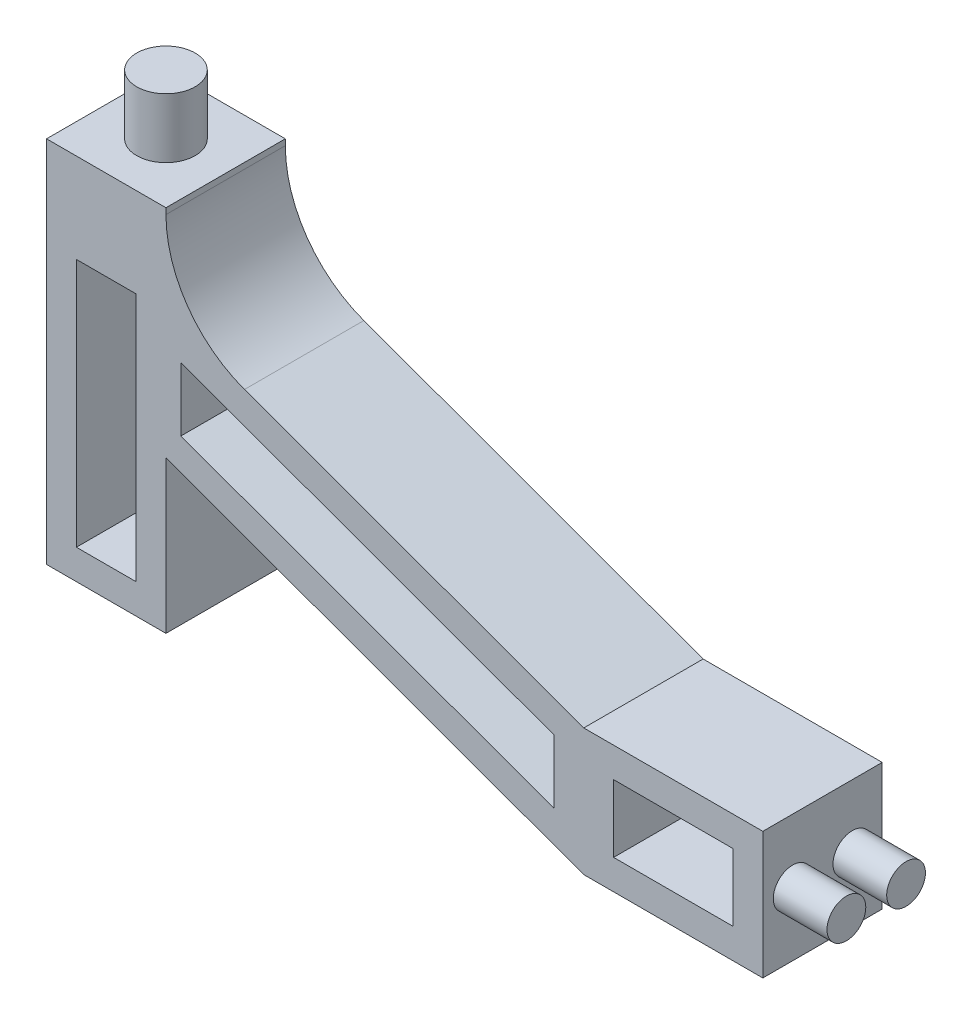
ISO-10303-21;
HEADER;
FILE_DESCRIPTION(('STEP AP214'),'2;1');
FILE_NAME('part.step','',(''),(''),'','','');
FILE_SCHEMA(('AUTOMOTIVE_DESIGN { 1 0 10303 214 1 1 1 1 }'));
ENDSEC;
DATA;
#1=APPLICATION_CONTEXT('core data for automotive mechanical design processes');
#2=APPLICATION_PROTOCOL_DEFINITION('international standard','automotive_design',2000,#1);
#3=PRODUCT_CONTEXT('',#1,'mechanical');
#4=PRODUCT('Part','Part','',(#3));
#5=PRODUCT_RELATED_PRODUCT_CATEGORY('part','',(#4));
#6=PRODUCT_DEFINITION_FORMATION('','',#4);
#7=PRODUCT_DEFINITION_CONTEXT('part definition',#1,'design');
#8=PRODUCT_DEFINITION('design','',#6,#7);
#9=PRODUCT_DEFINITION_SHAPE('','',#8);
#10=(LENGTH_UNIT() NAMED_UNIT(*) SI_UNIT(.MILLI.,.METRE.));
#11=(NAMED_UNIT(*) PLANE_ANGLE_UNIT() SI_UNIT($,.RADIAN.));
#12=(NAMED_UNIT(*) SI_UNIT($,.STERADIAN.) SOLID_ANGLE_UNIT());
#13=UNCERTAINTY_MEASURE_WITH_UNIT(LENGTH_MEASURE(1.E-05),#10,'distance_accuracy_value','');
#14=(GEOMETRIC_REPRESENTATION_CONTEXT(3) GLOBAL_UNCERTAINTY_ASSIGNED_CONTEXT((#13)) GLOBAL_UNIT_ASSIGNED_CONTEXT((#10,
#11,#12)) REPRESENTATION_CONTEXT('',''));
#15=CARTESIAN_POINT('',(0.,0.,0.));
#16=DIRECTION('',(0.,0.,1.));
#17=DIRECTION('',(1.,0.,0.));
#18=AXIS2_PLACEMENT_3D('',#15,#16,#17);
#19=CARTESIAN_POINT('',(0.,0.,20.));
#20=DIRECTION('',(0.,0.,1.));
#21=DIRECTION('',(1.,0.,0.));
#22=AXIS2_PLACEMENT_3D('',#19,#20,#21);
#23=PLANE('',#22);
#24=DIRECTION('',(0.,-1.,0.));
#25=VECTOR('',#24,1.);
#26=CARTESIAN_POINT('',(-125.,5.,20.));
#27=LINE('',#26,#25);
#28=CARTESIAN_POINT('',(-125.,46.7614718481525,20.));
#29=VERTEX_POINT('',#28);
#30=CARTESIAN_POINT('',(-125.,5.,20.));
#31=VERTEX_POINT('',#30);
#32=EDGE_CURVE('E344',#29,#31,#27,.T.);
#33=ORIENTED_EDGE('',*,*,#32,.F.);
#34=DIRECTION('',(-1.,0.,0.));
#35=VECTOR('',#34,1.);
#36=CARTESIAN_POINT('',(-125.,46.7614718481525,20.));
#37=LINE('',#36,#35);
#38=CARTESIAN_POINT('',(-115.,46.7614718481525,20.));
#39=VERTEX_POINT('',#38);
#40=EDGE_CURVE('E342',#39,#29,#37,.T.);
#41=ORIENTED_EDGE('',*,*,#40,.F.);
#42=DIRECTION('',(0.,1.,0.));
#43=VECTOR('',#42,1.);
#44=CARTESIAN_POINT('',(-115.,46.7614718481525,20.));
#45=LINE('',#44,#43);
#46=CARTESIAN_POINT('',(-115.,5.,20.));
#47=VERTEX_POINT('',#46);
#48=EDGE_CURVE('E350',#47,#39,#45,.T.);
#49=ORIENTED_EDGE('',*,*,#48,.F.);
#50=DIRECTION('',(1.,0.,0.));
#51=VECTOR('',#50,1.);
#52=CARTESIAN_POINT('',(-115.,5.,20.));
#53=LINE('',#52,#51);
#54=EDGE_CURVE('E347',#31,#47,#53,.T.);
#55=ORIENTED_EDGE('',*,*,#54,.F.);
#56=EDGE_LOOP('',(#33,#41,#49,#55));
#57=FACE_BOUND('',#56,.T.);
#58=DIRECTION('',(0.939692620785908,-0.342020143325669,0.));
#59=VECTOR('',#58,1.);
#60=CARTESIAN_POINT('',(-45.,7.14074003371057,20.));
#61=LINE('',#60,#59);
#62=CARTESIAN_POINT('',(-107.5,29.8888796753482,20.));
#63=VERTEX_POINT('',#62);
#64=CARTESIAN_POINT('',(-45.,7.14074003371057,20.));
#65=VERTEX_POINT('',#64);
#66=EDGE_CURVE('E313',#63,#65,#61,.T.);
#67=ORIENTED_EDGE('',*,*,#66,.F.);
#68=DIRECTION('',(0.,-1.,0.));
#69=VECTOR('',#68,1.);
#70=CARTESIAN_POINT('',(-107.5,29.8888796753482,20.));
#71=LINE('',#70,#69);
#72=CARTESIAN_POINT('',(-107.5,40.5306574001074,20.));
#73=VERTEX_POINT('',#72);
#74=EDGE_CURVE('E311',#73,#63,#71,.T.);
#75=ORIENTED_EDGE('',*,*,#74,.F.);
#76=DIRECTION('',(-0.939692620785908,0.342020143325669,0.));
#77=VECTOR('',#76,1.);
#78=CARTESIAN_POINT('',(-107.5,40.5306574001074,20.));
#79=LINE('',#78,#77);
#80=CARTESIAN_POINT('',(-45.,17.7825177584697,20.));
#81=VERTEX_POINT('',#80);
#82=EDGE_CURVE('E319',#81,#73,#79,.T.);
#83=ORIENTED_EDGE('',*,*,#82,.F.);
#84=DIRECTION('',(0.,1.,0.));
#85=VECTOR('',#84,1.);
#86=CARTESIAN_POINT('',(-45.,7.14074003371057,20.));
#87=LINE('',#86,#85);
#88=EDGE_CURVE('E316',#65,#81,#87,.T.);
#89=ORIENTED_EDGE('',*,*,#88,.F.);
#90=EDGE_LOOP('',(#67,#75,#83,#89));
#91=FACE_BOUND('',#90,.T.);
#92=DIRECTION('',(1.,0.,0.));
#93=VECTOR('',#92,1.);
#94=CARTESIAN_POINT('',(-35.,5.,20.));
#95=LINE('',#94,#93);
#96=CARTESIAN_POINT('',(-35.,5.,20.));
#97=VERTEX_POINT('',#96);
#98=CARTESIAN_POINT('',(-15.,5.,20.));
#99=VERTEX_POINT('',#98);
#100=EDGE_CURVE('E281',#97,#99,#95,.T.);
#101=ORIENTED_EDGE('',*,*,#100,.F.);
#102=DIRECTION('',(0.,-1.,0.));
#103=VECTOR('',#102,1.);
#104=CARTESIAN_POINT('',(-35.,16.2835554495182,20.));
#105=LINE('',#104,#103);
#106=CARTESIAN_POINT('',(-35.,16.2835554495182,20.));
#107=VERTEX_POINT('',#106);
#108=EDGE_CURVE('E279',#107,#97,#105,.T.);
#109=ORIENTED_EDGE('',*,*,#108,.F.);
#110=DIRECTION('',(-1.,0.,0.));
#111=VECTOR('',#110,1.);
#112=CARTESIAN_POINT('',(-35.,16.2835554495182,20.));
#113=LINE('',#112,#111);
#114=CARTESIAN_POINT('',(-15.,16.2835554495182,20.));
#115=VERTEX_POINT('',#114);
#116=EDGE_CURVE('E287',#115,#107,#113,.T.);
#117=ORIENTED_EDGE('',*,*,#116,.F.);
#118=DIRECTION('',(0.,1.,0.));
#119=VECTOR('',#118,1.);
#120=CARTESIAN_POINT('',(-15.,16.2835554495182,20.));
#121=LINE('',#120,#119);
#122=EDGE_CURVE('E284',#99,#115,#121,.T.);
#123=ORIENTED_EDGE('',*,*,#122,.F.);
#124=EDGE_LOOP('',(#101,#109,#117,#123));
#125=FACE_BOUND('',#124,.T.);
#126=DIRECTION('',(1.,0.,0.));
#127=VECTOR('',#126,1.);
#128=CARTESIAN_POINT('',(0.,0.,20.));
#129=LINE('',#128,#127);
#130=CARTESIAN_POINT('',(-40.,0.,20.));
#131=VERTEX_POINT('',#130);
#132=CARTESIAN_POINT('',(-10.,0.,20.));
#133=VERTEX_POINT('',#132);
#134=EDGE_CURVE('E200',#131,#133,#129,.T.);
#135=ORIENTED_EDGE('',*,*,#134,.T.);
#136=DIRECTION('',(0.,1.,0.));
#137=VECTOR('',#136,1.);
#138=CARTESIAN_POINT('',(-10.,0.,20.));
#139=LINE('',#138,#137);
#140=CARTESIAN_POINT('',(-10.,21.2835554495182,20.));
#141=VERTEX_POINT('',#140);
#142=EDGE_CURVE('E190',#133,#141,#139,.T.);
#143=ORIENTED_EDGE('',*,*,#142,.T.);
#144=DIRECTION('',(-1.,0.,0.));
#145=VECTOR('',#144,1.);
#146=CARTESIAN_POINT('',(-40.,21.2835554495182,20.));
#147=LINE('',#146,#145);
#148=CARTESIAN_POINT('',(-40.,21.2835554495182,20.));
#149=VERTEX_POINT('',#148);
#150=EDGE_CURVE('E197',#141,#149,#147,.T.);
#151=ORIENTED_EDGE('',*,*,#150,.T.);
#152=DIRECTION('',(-0.939692620785908,0.34202014332567,0.));
#153=VECTOR('',#152,1.);
#154=CARTESIAN_POINT('',(-110.,46.7614718481525,20.));
#155=LINE('',#154,#153);
#156=CARTESIAN_POINT('',(-96.8404028665134,41.9717701966285,20.));
#157=VERTEX_POINT('',#156);
#158=EDGE_CURVE('E206',#149,#157,#155,.T.);
#159=ORIENTED_EDGE('',*,*,#158,.T.);
#160=CARTESIAN_POINT('',(-90.,60.7656226123466,20.));
#161=DIRECTION('',(0.,0.,1.));
#162=DIRECTION('',(1.,0.,0.));
#163=AXIS2_PLACEMENT_3D('',#160,#161,#162);
#164=CIRCLE('',#163,20.);
#165=CARTESIAN_POINT('',(-110.,60.7656226123466,20.));
#166=VERTEX_POINT('',#165);
#167=EDGE_CURVE('E268',#157,#166,#164,.F.);
#168=ORIENTED_EDGE('',*,*,#167,.T.);
#169=DIRECTION('',(0.,1.,0.));
#170=VECTOR('',#169,1.);
#171=CARTESIAN_POINT('',(-110.,46.7614718481525,20.));
#172=LINE('',#171,#170);
#173=CARTESIAN_POINT('',(-110.,61.7614718481525,20.));
#174=VERTEX_POINT('',#173);
#175=EDGE_CURVE('E208',#166,#174,#172,.T.);
#176=ORIENTED_EDGE('',*,*,#175,.T.);
#177=DIRECTION('',(-1.,0.,0.));
#178=VECTOR('',#177,1.);
#179=CARTESIAN_POINT('',(-110.,61.7614718481525,20.));
#180=LINE('',#179,#178);
#181=CARTESIAN_POINT('',(-130.,61.7614718481524,20.));
#182=VERTEX_POINT('',#181);
#183=EDGE_CURVE('E215',#174,#182,#180,.T.);
#184=ORIENTED_EDGE('',*,*,#183,.T.);
#185=DIRECTION('',(0.,-1.,0.));
#186=VECTOR('',#185,1.);
#187=CARTESIAN_POINT('',(-130.,0.,20.));
#188=LINE('',#187,#186);
#189=CARTESIAN_POINT('',(-130.,0.,20.));
#190=VERTEX_POINT('',#189);
#191=EDGE_CURVE('E217',#182,#190,#188,.T.);
#192=ORIENTED_EDGE('',*,*,#191,.T.);
#193=DIRECTION('',(1.,0.,0.));
#194=VECTOR('',#193,1.);
#195=CARTESIAN_POINT('',(-110.,0.,20.));
#196=LINE('',#195,#194);
#197=CARTESIAN_POINT('',(-110.,0.,20.));
#198=VERTEX_POINT('',#197);
#199=EDGE_CURVE('E219',#190,#198,#196,.T.);
#200=ORIENTED_EDGE('',*,*,#199,.T.);
#201=DIRECTION('',(0.,1.,0.));
#202=VECTOR('',#201,1.);
#203=CARTESIAN_POINT('',(-110.,25.4779163986342,20.));
#204=LINE('',#203,#202);
#205=CARTESIAN_POINT('',(-110.,25.4779163986342,20.));
#206=VERTEX_POINT('',#205);
#207=EDGE_CURVE('E221',#198,#206,#204,.T.);
#208=ORIENTED_EDGE('',*,*,#207,.T.);
#209=DIRECTION('',(0.939692620785908,-0.342020143325669,0.));
#210=VECTOR('',#209,1.);
#211=CARTESIAN_POINT('',(-40.,0.,20.));
#212=LINE('',#211,#210);
#213=EDGE_CURVE('E223',#206,#131,#212,.T.);
#214=ORIENTED_EDGE('',*,*,#213,.T.);
#215=EDGE_LOOP('',(#135,#143,#151,#159,#168,#176,#184,#192,#200,#208,#214));
#216=FACE_BOUND('',#215,.T.);
#217=ADVANCED_FACE('F35',(#57,#91,#125,#216),#23,.T.);
#218=CARTESIAN_POINT('',(0.,0.,0.));
#219=DIRECTION('',(0.,0.,1.));
#220=DIRECTION('',(1.,0.,0.));
#221=AXIS2_PLACEMENT_3D('',#218,#219,#220);
#222=PLANE('',#221);
#223=DIRECTION('',(0.,-1.,0.));
#224=VECTOR('',#223,1.);
#225=CARTESIAN_POINT('',(-35.,16.2835554495182,0.));
#226=LINE('',#225,#224);
#227=CARTESIAN_POINT('',(-35.,16.2835554495182,0.));
#228=VERTEX_POINT('',#227);
#229=CARTESIAN_POINT('',(-35.,5.,0.));
#230=VERTEX_POINT('',#229);
#231=EDGE_CURVE('E290',#228,#230,#226,.T.);
#232=ORIENTED_EDGE('',*,*,#231,.T.);
#233=DIRECTION('',(1.,0.,0.));
#234=VECTOR('',#233,1.);
#235=CARTESIAN_POINT('',(-35.,5.,0.));
#236=LINE('',#235,#234);
#237=CARTESIAN_POINT('',(-15.,5.,0.));
#238=VERTEX_POINT('',#237);
#239=EDGE_CURVE('E293',#230,#238,#236,.T.);
#240=ORIENTED_EDGE('',*,*,#239,.T.);
#241=DIRECTION('',(0.,1.,0.));
#242=VECTOR('',#241,1.);
#243=CARTESIAN_POINT('',(-15.,16.2835554495182,0.));
#244=LINE('',#243,#242);
#245=CARTESIAN_POINT('',(-15.,16.2835554495182,0.));
#246=VERTEX_POINT('',#245);
#247=EDGE_CURVE('E296',#238,#246,#244,.T.);
#248=ORIENTED_EDGE('',*,*,#247,.T.);
#249=DIRECTION('',(-1.,0.,0.));
#250=VECTOR('',#249,1.);
#251=CARTESIAN_POINT('',(-35.,16.2835554495182,0.));
#252=LINE('',#251,#250);
#253=EDGE_CURVE('E282',#246,#228,#252,.T.);
#254=ORIENTED_EDGE('',*,*,#253,.T.);
#255=EDGE_LOOP('',(#232,#240,#248,#254));
#256=FACE_BOUND('',#255,.T.);
#257=DIRECTION('',(-1.,0.,0.));
#258=VECTOR('',#257,1.);
#259=CARTESIAN_POINT('',(-125.,46.7614718481525,0.));
#260=LINE('',#259,#258);
#261=CARTESIAN_POINT('',(-115.,46.7614718481525,0.));
#262=VERTEX_POINT('',#261);
#263=CARTESIAN_POINT('',(-125.,46.7614718481525,0.));
#264=VERTEX_POINT('',#263);
#265=EDGE_CURVE('E341',#262,#264,#260,.T.);
#266=ORIENTED_EDGE('',*,*,#265,.T.);
#267=DIRECTION('',(0.,-1.,0.));
#268=VECTOR('',#267,1.);
#269=CARTESIAN_POINT('',(-125.,5.,0.));
#270=LINE('',#269,#268);
#271=CARTESIAN_POINT('',(-125.,5.,0.));
#272=VERTEX_POINT('',#271);
#273=EDGE_CURVE('E355',#264,#272,#270,.T.);
#274=ORIENTED_EDGE('',*,*,#273,.T.);
#275=DIRECTION('',(1.,0.,0.));
#276=VECTOR('',#275,1.);
#277=CARTESIAN_POINT('',(-115.,5.,0.));
#278=LINE('',#277,#276);
#279=CARTESIAN_POINT('',(-115.,5.,0.));
#280=VERTEX_POINT('',#279);
#281=EDGE_CURVE('E358',#272,#280,#278,.T.);
#282=ORIENTED_EDGE('',*,*,#281,.T.);
#283=DIRECTION('',(0.,1.,0.));
#284=VECTOR('',#283,1.);
#285=CARTESIAN_POINT('',(-115.,46.7614718481525,0.));
#286=LINE('',#285,#284);
#287=EDGE_CURVE('E345',#280,#262,#286,.T.);
#288=ORIENTED_EDGE('',*,*,#287,.T.);
#289=EDGE_LOOP('',(#266,#274,#282,#288));
#290=FACE_BOUND('',#289,.T.);
#291=DIRECTION('',(0.,-1.,0.));
#292=VECTOR('',#291,1.);
#293=CARTESIAN_POINT('',(-107.5,29.8888796753482,0.));
#294=LINE('',#293,#292);
#295=CARTESIAN_POINT('',(-107.5,40.5306574001074,0.));
#296=VERTEX_POINT('',#295);
#297=CARTESIAN_POINT('',(-107.5,29.8888796753482,0.));
#298=VERTEX_POINT('',#297);
#299=EDGE_CURVE('E310',#296,#298,#294,.T.);
#300=ORIENTED_EDGE('',*,*,#299,.T.);
#301=DIRECTION('',(0.939692620785908,-0.342020143325669,0.));
#302=VECTOR('',#301,1.);
#303=CARTESIAN_POINT('',(-45.,7.14074003371057,0.));
#304=LINE('',#303,#302);
#305=CARTESIAN_POINT('',(-45.,7.14074003371057,0.));
#306=VERTEX_POINT('',#305);
#307=EDGE_CURVE('E324',#298,#306,#304,.T.);
#308=ORIENTED_EDGE('',*,*,#307,.T.);
#309=DIRECTION('',(0.,1.,0.));
#310=VECTOR('',#309,1.);
#311=CARTESIAN_POINT('',(-45.,7.14074003371057,0.));
#312=LINE('',#311,#310);
#313=CARTESIAN_POINT('',(-45.,17.7825177584697,0.));
#314=VERTEX_POINT('',#313);
#315=EDGE_CURVE('E327',#306,#314,#312,.T.);
#316=ORIENTED_EDGE('',*,*,#315,.T.);
#317=DIRECTION('',(-0.939692620785908,0.342020143325669,0.));
#318=VECTOR('',#317,1.);
#319=CARTESIAN_POINT('',(-107.5,40.5306574001074,0.));
#320=LINE('',#319,#318);
#321=EDGE_CURVE('E314',#314,#296,#320,.T.);
#322=ORIENTED_EDGE('',*,*,#321,.T.);
#323=EDGE_LOOP('',(#300,#308,#316,#322));
#324=FACE_BOUND('',#323,.T.);
#325=DIRECTION('',(0.,1.,0.));
#326=VECTOR('',#325,1.);
#327=CARTESIAN_POINT('',(-10.,0.,0.));
#328=LINE('',#327,#326);
#329=CARTESIAN_POINT('',(-10.,0.,0.));
#330=VERTEX_POINT('',#329);
#331=CARTESIAN_POINT('',(-10.,21.2835554495182,0.));
#332=VERTEX_POINT('',#331);
#333=EDGE_CURVE('E49',#330,#332,#328,.T.);
#334=ORIENTED_EDGE('',*,*,#333,.F.);
#335=DIRECTION('',(1.,0.,0.));
#336=VECTOR('',#335,1.);
#337=CARTESIAN_POINT('',(0.,0.,0.));
#338=LINE('',#337,#336);
#339=CARTESIAN_POINT('',(-40.,0.,0.));
#340=VERTEX_POINT('',#339);
#341=EDGE_CURVE('E226',#340,#330,#338,.T.);
#342=ORIENTED_EDGE('',*,*,#341,.F.);
#343=DIRECTION('',(0.939692620785908,-0.342020143325669,0.));
#344=VECTOR('',#343,1.);
#345=CARTESIAN_POINT('',(-40.,0.,0.));
#346=LINE('',#345,#344);
#347=CARTESIAN_POINT('',(-110.,25.4779163986342,0.));
#348=VERTEX_POINT('',#347);
#349=EDGE_CURVE('E210',#348,#340,#346,.T.);
#350=ORIENTED_EDGE('',*,*,#349,.F.);
#351=DIRECTION('',(0.,1.,0.));
#352=VECTOR('',#351,1.);
#353=CARTESIAN_POINT('',(-110.,25.4779163986342,0.));
#354=LINE('',#353,#352);
#355=CARTESIAN_POINT('',(-110.,0.,0.));
#356=VERTEX_POINT('',#355);
#357=EDGE_CURVE('E242',#356,#348,#354,.T.);
#358=ORIENTED_EDGE('',*,*,#357,.F.);
#359=DIRECTION('',(1.,0.,0.));
#360=VECTOR('',#359,1.);
#361=CARTESIAN_POINT('',(-110.,0.,0.));
#362=LINE('',#361,#360);
#363=CARTESIAN_POINT('',(-130.,0.,0.));
#364=VERTEX_POINT('',#363);
#365=EDGE_CURVE('E240',#364,#356,#362,.T.);
#366=ORIENTED_EDGE('',*,*,#365,.F.);
#367=DIRECTION('',(0.,-1.,0.));
#368=VECTOR('',#367,1.);
#369=CARTESIAN_POINT('',(-130.,0.,0.));
#370=LINE('',#369,#368);
#371=CARTESIAN_POINT('',(-130.,61.7614718481524,0.));
#372=VERTEX_POINT('',#371);
#373=EDGE_CURVE('E238',#372,#364,#370,.T.);
#374=ORIENTED_EDGE('',*,*,#373,.F.);
#375=DIRECTION('',(-1.,0.,0.));
#376=VECTOR('',#375,1.);
#377=CARTESIAN_POINT('',(-110.,61.7614718481525,0.));
#378=LINE('',#377,#376);
#379=CARTESIAN_POINT('',(-110.,61.7614718481525,0.));
#380=VERTEX_POINT('',#379);
#381=EDGE_CURVE('E236',#380,#372,#378,.T.);
#382=ORIENTED_EDGE('',*,*,#381,.F.);
#383=DIRECTION('',(0.,1.,0.));
#384=VECTOR('',#383,1.);
#385=CARTESIAN_POINT('',(-110.,46.7614718481525,0.));
#386=LINE('',#385,#384);
#387=CARTESIAN_POINT('',(-110.,60.7656226123466,0.));
#388=VERTEX_POINT('',#387);
#389=EDGE_CURVE('E234',#388,#380,#386,.T.);
#390=ORIENTED_EDGE('',*,*,#389,.F.);
#391=CARTESIAN_POINT('',(-90.,60.7656226123466,0.));
#392=DIRECTION('',(0.,0.,1.));
#393=DIRECTION('',(1.,0.,0.));
#394=AXIS2_PLACEMENT_3D('',#391,#392,#393);
#395=CIRCLE('',#394,20.);
#396=CARTESIAN_POINT('',(-96.8404028665134,41.9717701966285,0.));
#397=VERTEX_POINT('',#396);
#398=EDGE_CURVE('E267',#388,#397,#395,.T.);
#399=ORIENTED_EDGE('',*,*,#398,.T.);
#400=DIRECTION('',(-0.939692620785908,0.34202014332567,0.));
#401=VECTOR('',#400,1.);
#402=CARTESIAN_POINT('',(-110.,46.7614718481525,0.));
#403=LINE('',#402,#401);
#404=CARTESIAN_POINT('',(-40.,21.2835554495182,0.));
#405=VERTEX_POINT('',#404);
#406=EDGE_CURVE('E232',#405,#397,#403,.T.);
#407=ORIENTED_EDGE('',*,*,#406,.F.);
#408=DIRECTION('',(-1.,0.,0.));
#409=VECTOR('',#408,1.);
#410=CARTESIAN_POINT('',(-40.,21.2835554495182,0.));
#411=LINE('',#410,#409);
#412=EDGE_CURVE('E229',#332,#405,#411,.T.);
#413=ORIENTED_EDGE('',*,*,#412,.F.);
#414=EDGE_LOOP('',(#334,#342,#350,#358,#366,#374,#382,#390,#399,#407,#413));
#415=FACE_BOUND('',#414,.T.);
#416=ADVANCED_FACE('F377',(#256,#290,#324,#415),#222,.F.);
#417=CARTESIAN_POINT('',(0.,0.,20.));
#418=DIRECTION('',(0.,1.,0.));
#419=DIRECTION('',(-1.,0.,0.));
#420=AXIS2_PLACEMENT_3D('',#417,#418,#419);
#421=PLANE('',#420);
#422=DIRECTION('',(0.,0.,-1.));
#423=VECTOR('',#422,1.);
#424=CARTESIAN_POINT('',(-10.,0.,20.));
#425=LINE('',#424,#423);
#426=EDGE_CURVE('E201',#133,#330,#425,.T.);
#427=ORIENTED_EDGE('',*,*,#426,.F.);
#428=ORIENTED_EDGE('',*,*,#134,.F.);
#429=DIRECTION('',(0.,0.,-1.));
#430=VECTOR('',#429,1.);
#431=CARTESIAN_POINT('',(-40.,0.,20.));
#432=LINE('',#431,#430);
#433=EDGE_CURVE('E225',#131,#340,#432,.T.);
#434=ORIENTED_EDGE('',*,*,#433,.T.);
#435=ORIENTED_EDGE('',*,*,#341,.T.);
#436=EDGE_LOOP('',(#427,#428,#434,#435));
#437=FACE_BOUND('',#436,.T.);
#438=ADVANCED_FACE('F405',(#437),#421,.F.);
#439=CARTESIAN_POINT('',(-40.,21.2835554495182,20.));
#440=DIRECTION('',(0.,-1.,0.));
#441=DIRECTION('',(1.,0.,0.));
#442=AXIS2_PLACEMENT_3D('',#439,#440,#441);
#443=PLANE('',#442);
#444=DIRECTION('',(0.,0.,1.));
#445=VECTOR('',#444,1.);
#446=CARTESIAN_POINT('',(-10.,21.2835554495182,20.));
#447=LINE('',#446,#445);
#448=EDGE_CURVE('E11',#332,#141,#447,.T.);
#449=ORIENTED_EDGE('',*,*,#448,.F.);
#450=ORIENTED_EDGE('',*,*,#412,.T.);
#451=DIRECTION('',(0.,0.,-1.));
#452=VECTOR('',#451,1.);
#453=CARTESIAN_POINT('',(-40.,21.2835554495182,20.));
#454=LINE('',#453,#452);
#455=EDGE_CURVE('E205',#149,#405,#454,.T.);
#456=ORIENTED_EDGE('',*,*,#455,.F.);
#457=ORIENTED_EDGE('',*,*,#150,.F.);
#458=EDGE_LOOP('',(#449,#450,#456,#457));
#459=FACE_BOUND('',#458,.T.);
#460=ADVANCED_FACE('F203',(#459),#443,.F.);
#461=CARTESIAN_POINT('',(-110.,46.7614718481525,20.));
#462=DIRECTION('',(-0.34202014332567,-0.939692620785908,0.));
#463=DIRECTION('',(0.939692620785908,-0.34202014332567,0.));
#464=AXIS2_PLACEMENT_3D('',#461,#462,#463);
#465=PLANE('',#464);
#466=ORIENTED_EDGE('',*,*,#406,.T.);
#467=DIRECTION('',(0.,0.,-1.));
#468=VECTOR('',#467,1.);
#469=CARTESIAN_POINT('',(-96.8404028665134,41.9717701966285,20.));
#470=LINE('',#469,#468);
#471=EDGE_CURVE('E57',#397,#157,#470,.F.);
#472=ORIENTED_EDGE('',*,*,#471,.T.);
#473=ORIENTED_EDGE('',*,*,#158,.F.);
#474=ORIENTED_EDGE('',*,*,#455,.T.);
#475=EDGE_LOOP('',(#466,#472,#473,#474));
#476=FACE_BOUND('',#475,.T.);
#477=ADVANCED_FACE('F433',(#476),#465,.F.);
#478=CARTESIAN_POINT('',(-110.,46.7614718481525,20.));
#479=DIRECTION('',(-1.,0.,0.));
#480=DIRECTION('',(0.,-1.,0.));
#481=AXIS2_PLACEMENT_3D('',#478,#479,#480);
#482=PLANE('',#481);
#483=ORIENTED_EDGE('',*,*,#175,.F.);
#484=DIRECTION('',(0.,0.,-1.));
#485=VECTOR('',#484,1.);
#486=CARTESIAN_POINT('',(-110.,60.7656226123466,0.));
#487=LINE('',#486,#485);
#488=EDGE_CURVE('E263',#166,#388,#487,.T.);
#489=ORIENTED_EDGE('',*,*,#488,.T.);
#490=ORIENTED_EDGE('',*,*,#389,.T.);
#491=DIRECTION('',(0.,0.,-1.));
#492=VECTOR('',#491,1.);
#493=CARTESIAN_POINT('',(-110.,61.7614718481525,20.));
#494=LINE('',#493,#492);
#495=EDGE_CURVE('E259',#174,#380,#494,.T.);
#496=ORIENTED_EDGE('',*,*,#495,.F.);
#497=EDGE_LOOP('',(#483,#489,#490,#496));
#498=FACE_BOUND('',#497,.T.);
#499=ADVANCED_FACE('F429',(#498),#482,.F.);
#500=CARTESIAN_POINT('',(-110.,61.7614718481525,20.));
#501=DIRECTION('',(0.,-1.,0.));
#502=DIRECTION('',(1.,0.,0.));
#503=AXIS2_PLACEMENT_3D('',#500,#501,#502);
#504=PLANE('',#503);
#505=CARTESIAN_POINT('',(-120.,61.7614718481525,10.));
#506=DIRECTION('',(0.,1.,0.));
#507=DIRECTION('',(0.,0.,1.));
#508=AXIS2_PLACEMENT_3D('',#505,#506,#507);
#509=CIRCLE('',#508,4.9);
#510=CARTESIAN_POINT('',(-120.,61.7614718481525,14.9));
#511=VERTEX_POINT('',#510);
#512=EDGE_CURVE('E43',#511,#511,#509,.T.);
#513=ORIENTED_EDGE('',*,*,#512,.F.);
#514=EDGE_LOOP('',(#513));
#515=FACE_BOUND('',#514,.T.);
#516=ORIENTED_EDGE('',*,*,#381,.T.);
#517=DIRECTION('',(0.,0.,-1.));
#518=VECTOR('',#517,1.);
#519=CARTESIAN_POINT('',(-130.,61.7614718481524,20.));
#520=LINE('',#519,#518);
#521=EDGE_CURVE('E256',#182,#372,#520,.T.);
#522=ORIENTED_EDGE('',*,*,#521,.F.);
#523=ORIENTED_EDGE('',*,*,#183,.F.);
#524=ORIENTED_EDGE('',*,*,#495,.T.);
#525=EDGE_LOOP('',(#516,#522,#523,#524));
#526=FACE_BOUND('',#525,.T.);
#527=ADVANCED_FACE('F425',(#515,#526),#504,.F.);
#528=CARTESIAN_POINT('',(-130.,0.,20.));
#529=DIRECTION('',(1.,0.,0.));
#530=DIRECTION('',(0.,0.,-1.));
#531=AXIS2_PLACEMENT_3D('',#528,#529,#530);
#532=PLANE('',#531);
#533=ORIENTED_EDGE('',*,*,#373,.T.);
#534=DIRECTION('',(0.,0.,-1.));
#535=VECTOR('',#534,1.);
#536=CARTESIAN_POINT('',(-130.,0.,20.));
#537=LINE('',#536,#535);
#538=EDGE_CURVE('E253',#190,#364,#537,.T.);
#539=ORIENTED_EDGE('',*,*,#538,.F.);
#540=ORIENTED_EDGE('',*,*,#191,.F.);
#541=ORIENTED_EDGE('',*,*,#521,.T.);
#542=EDGE_LOOP('',(#533,#539,#540,#541));
#543=FACE_BOUND('',#542,.T.);
#544=ADVANCED_FACE('F421',(#543),#532,.F.);
#545=CARTESIAN_POINT('',(-110.,0.,20.));
#546=DIRECTION('',(0.,1.,0.));
#547=DIRECTION('',(-1.,0.,0.));
#548=AXIS2_PLACEMENT_3D('',#545,#546,#547);
#549=PLANE('',#548);
#550=ORIENTED_EDGE('',*,*,#365,.T.);
#551=DIRECTION('',(0.,0.,-1.));
#552=VECTOR('',#551,1.);
#553=CARTESIAN_POINT('',(-110.,0.,20.));
#554=LINE('',#553,#552);
#555=EDGE_CURVE('E250',#198,#356,#554,.T.);
#556=ORIENTED_EDGE('',*,*,#555,.F.);
#557=ORIENTED_EDGE('',*,*,#199,.F.);
#558=ORIENTED_EDGE('',*,*,#538,.T.);
#559=EDGE_LOOP('',(#550,#556,#557,#558));
#560=FACE_BOUND('',#559,.T.);
#561=ADVANCED_FACE('F417',(#560),#549,.F.);
#562=CARTESIAN_POINT('',(-110.,25.4779163986342,20.));
#563=DIRECTION('',(-1.,0.,0.));
#564=DIRECTION('',(0.,-1.,0.));
#565=AXIS2_PLACEMENT_3D('',#562,#563,#564);
#566=PLANE('',#565);
#567=ORIENTED_EDGE('',*,*,#357,.T.);
#568=DIRECTION('',(0.,0.,-1.));
#569=VECTOR('',#568,1.);
#570=CARTESIAN_POINT('',(-110.,25.4779163986342,20.));
#571=LINE('',#570,#569);
#572=EDGE_CURVE('E247',#206,#348,#571,.T.);
#573=ORIENTED_EDGE('',*,*,#572,.F.);
#574=ORIENTED_EDGE('',*,*,#207,.F.);
#575=ORIENTED_EDGE('',*,*,#555,.T.);
#576=EDGE_LOOP('',(#567,#573,#574,#575));
#577=FACE_BOUND('',#576,.T.);
#578=ADVANCED_FACE('F413',(#577),#566,.F.);
#579=CARTESIAN_POINT('',(-40.,0.,20.));
#580=DIRECTION('',(0.342020143325669,0.939692620785908,0.));
#581=DIRECTION('',(-0.939692620785908,0.342020143325669,0.));
#582=AXIS2_PLACEMENT_3D('',#579,#580,#581);
#583=PLANE('',#582);
#584=ORIENTED_EDGE('',*,*,#349,.T.);
#585=ORIENTED_EDGE('',*,*,#433,.F.);
#586=ORIENTED_EDGE('',*,*,#213,.F.);
#587=ORIENTED_EDGE('',*,*,#572,.T.);
#588=EDGE_LOOP('',(#584,#585,#586,#587));
#589=FACE_BOUND('',#588,.T.);
#590=ADVANCED_FACE('F410',(#589),#583,.F.);
#591=CARTESIAN_POINT('',(-125.,46.7614718481525,20.));
#592=DIRECTION('',(0.,-1.,0.));
#593=DIRECTION('',(0.,0.,-1.));
#594=AXIS2_PLACEMENT_3D('',#591,#592,#593);
#595=PLANE('',#594);
#596=ORIENTED_EDGE('',*,*,#265,.F.);
#597=DIRECTION('',(0.,0.,-1.));
#598=VECTOR('',#597,1.);
#599=CARTESIAN_POINT('',(-115.,46.7614718481525,20.));
#600=LINE('',#599,#598);
#601=EDGE_CURVE('E352',#39,#262,#600,.T.);
#602=ORIENTED_EDGE('',*,*,#601,.F.);
#603=ORIENTED_EDGE('',*,*,#40,.T.);
#604=DIRECTION('',(0.,0.,-1.));
#605=VECTOR('',#604,1.);
#606=CARTESIAN_POINT('',(-125.,46.7614718481525,20.));
#607=LINE('',#606,#605);
#608=EDGE_CURVE('E230',#29,#264,#607,.T.);
#609=ORIENTED_EDGE('',*,*,#608,.T.);
#610=EDGE_LOOP('',(#596,#602,#603,#609));
#611=FACE_BOUND('',#610,.T.);
#612=ADVANCED_FACE('F371',(#611),#595,.T.);
#613=CARTESIAN_POINT('',(-125.,5.,20.));
#614=DIRECTION('',(1.,0.,0.));
#615=DIRECTION('',(0.,0.,-1.));
#616=AXIS2_PLACEMENT_3D('',#613,#614,#615);
#617=PLANE('',#616);
#618=ORIENTED_EDGE('',*,*,#273,.F.);
#619=ORIENTED_EDGE('',*,*,#608,.F.);
#620=ORIENTED_EDGE('',*,*,#32,.T.);
#621=DIRECTION('',(0.,0.,-1.));
#622=VECTOR('',#621,1.);
#623=CARTESIAN_POINT('',(-125.,5.,20.));
#624=LINE('',#623,#622);
#625=EDGE_CURVE('E367',#31,#272,#624,.T.);
#626=ORIENTED_EDGE('',*,*,#625,.T.);
#627=EDGE_LOOP('',(#618,#619,#620,#626));
#628=FACE_BOUND('',#627,.T.);
#629=ADVANCED_FACE('F388',(#628),#617,.T.);
#630=CARTESIAN_POINT('',(-115.,5.,20.));
#631=DIRECTION('',(0.,1.,0.));
#632=DIRECTION('',(-1.,0.,0.));
#633=AXIS2_PLACEMENT_3D('',#630,#631,#632);
#634=PLANE('',#633);
#635=ORIENTED_EDGE('',*,*,#281,.F.);
#636=ORIENTED_EDGE('',*,*,#625,.F.);
#637=ORIENTED_EDGE('',*,*,#54,.T.);
#638=DIRECTION('',(0.,0.,-1.));
#639=VECTOR('',#638,1.);
#640=CARTESIAN_POINT('',(-115.,5.,20.));
#641=LINE('',#640,#639);
#642=EDGE_CURVE('E365',#47,#280,#641,.T.);
#643=ORIENTED_EDGE('',*,*,#642,.T.);
#644=EDGE_LOOP('',(#635,#636,#637,#643));
#645=FACE_BOUND('',#644,.T.);
#646=ADVANCED_FACE('F390',(#645),#634,.T.);
#647=CARTESIAN_POINT('',(-115.,46.7614718481525,20.));
#648=DIRECTION('',(-1.,0.,0.));
#649=DIRECTION('',(0.,0.,1.));
#650=AXIS2_PLACEMENT_3D('',#647,#648,#649);
#651=PLANE('',#650);
#652=ORIENTED_EDGE('',*,*,#287,.F.);
#653=ORIENTED_EDGE('',*,*,#642,.F.);
#654=ORIENTED_EDGE('',*,*,#48,.T.);
#655=ORIENTED_EDGE('',*,*,#601,.T.);
#656=EDGE_LOOP('',(#652,#653,#654,#655));
#657=FACE_BOUND('',#656,.T.);
#658=ADVANCED_FACE('F382',(#657),#651,.T.);
#659=CARTESIAN_POINT('',(-107.5,29.8888796753482,20.));
#660=DIRECTION('',(1.,0.,0.));
#661=DIRECTION('',(0.,0.,-1.));
#662=AXIS2_PLACEMENT_3D('',#659,#660,#661);
#663=PLANE('',#662);
#664=ORIENTED_EDGE('',*,*,#299,.F.);
#665=DIRECTION('',(0.,0.,-1.));
#666=VECTOR('',#665,1.);
#667=CARTESIAN_POINT('',(-107.5,40.5306574001074,20.));
#668=LINE('',#667,#666);
#669=EDGE_CURVE('E321',#73,#296,#668,.T.);
#670=ORIENTED_EDGE('',*,*,#669,.F.);
#671=ORIENTED_EDGE('',*,*,#74,.T.);
#672=DIRECTION('',(0.,0.,-1.));
#673=VECTOR('',#672,1.);
#674=CARTESIAN_POINT('',(-107.5,29.8888796753482,20.));
#675=LINE('',#674,#673);
#676=EDGE_CURVE('E338',#63,#298,#675,.T.);
#677=ORIENTED_EDGE('',*,*,#676,.T.);
#678=EDGE_LOOP('',(#664,#670,#671,#677));
#679=FACE_BOUND('',#678,.T.);
#680=ADVANCED_FACE('F397',(#679),#663,.T.);
#681=CARTESIAN_POINT('',(-45.,7.14074003371057,20.));
#682=DIRECTION('',(0.342020143325669,0.939692620785908,0.));
#683=DIRECTION('',(-0.939692620785908,0.342020143325669,0.));
#684=AXIS2_PLACEMENT_3D('',#681,#682,#683);
#685=PLANE('',#684);
#686=ORIENTED_EDGE('',*,*,#307,.F.);
#687=ORIENTED_EDGE('',*,*,#676,.F.);
#688=ORIENTED_EDGE('',*,*,#66,.T.);
#689=DIRECTION('',(0.,0.,-1.));
#690=VECTOR('',#689,1.);
#691=CARTESIAN_POINT('',(-45.,7.14074003371057,20.));
#692=LINE('',#691,#690);
#693=EDGE_CURVE('E336',#65,#306,#692,.T.);
#694=ORIENTED_EDGE('',*,*,#693,.T.);
#695=EDGE_LOOP('',(#686,#687,#688,#694));
#696=FACE_BOUND('',#695,.T.);
#697=ADVANCED_FACE('F515',(#696),#685,.T.);
#698=CARTESIAN_POINT('',(-45.,7.14074003371057,20.));
#699=DIRECTION('',(-1.,0.,0.));
#700=DIRECTION('',(0.,-1.,0.));
#701=AXIS2_PLACEMENT_3D('',#698,#699,#700);
#702=PLANE('',#701);
#703=ORIENTED_EDGE('',*,*,#315,.F.);
#704=ORIENTED_EDGE('',*,*,#693,.F.);
#705=ORIENTED_EDGE('',*,*,#88,.T.);
#706=DIRECTION('',(0.,0.,-1.));
#707=VECTOR('',#706,1.);
#708=CARTESIAN_POINT('',(-45.,17.7825177584697,20.));
#709=LINE('',#708,#707);
#710=EDGE_CURVE('E334',#81,#314,#709,.T.);
#711=ORIENTED_EDGE('',*,*,#710,.T.);
#712=EDGE_LOOP('',(#703,#704,#705,#711));
#713=FACE_BOUND('',#712,.T.);
#714=ADVANCED_FACE('F511',(#713),#702,.T.);
#715=CARTESIAN_POINT('',(-107.5,40.5306574001074,20.));
#716=DIRECTION('',(-0.342020143325669,-0.939692620785908,0.));
#717=DIRECTION('',(0.939692620785908,-0.342020143325669,0.));
#718=AXIS2_PLACEMENT_3D('',#715,#716,#717);
#719=PLANE('',#718);
#720=ORIENTED_EDGE('',*,*,#321,.F.);
#721=ORIENTED_EDGE('',*,*,#710,.F.);
#722=ORIENTED_EDGE('',*,*,#82,.T.);
#723=ORIENTED_EDGE('',*,*,#669,.T.);
#724=EDGE_LOOP('',(#720,#721,#722,#723));
#725=FACE_BOUND('',#724,.T.);
#726=ADVANCED_FACE('F507',(#725),#719,.T.);
#727=CARTESIAN_POINT('',(-35.,16.2835554495182,20.));
#728=DIRECTION('',(1.,0.,0.));
#729=DIRECTION('',(0.,0.,-1.));
#730=AXIS2_PLACEMENT_3D('',#727,#728,#729);
#731=PLANE('',#730);
#732=ORIENTED_EDGE('',*,*,#231,.F.);
#733=DIRECTION('',(0.,0.,-1.));
#734=VECTOR('',#733,1.);
#735=CARTESIAN_POINT('',(-35.,16.2835554495182,20.));
#736=LINE('',#735,#734);
#737=EDGE_CURVE('E289',#107,#228,#736,.T.);
#738=ORIENTED_EDGE('',*,*,#737,.F.);
#739=ORIENTED_EDGE('',*,*,#108,.T.);
#740=DIRECTION('',(0.,0.,-1.));
#741=VECTOR('',#740,1.);
#742=CARTESIAN_POINT('',(-35.,5.,20.));
#743=LINE('',#742,#741);
#744=EDGE_CURVE('E307',#97,#230,#743,.T.);
#745=ORIENTED_EDGE('',*,*,#744,.T.);
#746=EDGE_LOOP('',(#732,#738,#739,#745));
#747=FACE_BOUND('',#746,.T.);
#748=ADVANCED_FACE('F503',(#747),#731,.T.);
#749=CARTESIAN_POINT('',(-35.,5.,20.));
#750=DIRECTION('',(0.,1.,0.));
#751=DIRECTION('',(0.,0.,1.));
#752=AXIS2_PLACEMENT_3D('',#749,#750,#751);
#753=PLANE('',#752);
#754=ORIENTED_EDGE('',*,*,#239,.F.);
#755=ORIENTED_EDGE('',*,*,#744,.F.);
#756=ORIENTED_EDGE('',*,*,#100,.T.);
#757=DIRECTION('',(0.,0.,-1.));
#758=VECTOR('',#757,1.);
#759=CARTESIAN_POINT('',(-15.,5.,20.));
#760=LINE('',#759,#758);
#761=EDGE_CURVE('E305',#99,#238,#760,.T.);
#762=ORIENTED_EDGE('',*,*,#761,.T.);
#763=EDGE_LOOP('',(#754,#755,#756,#762));
#764=FACE_BOUND('',#763,.T.);
#765=ADVANCED_FACE('F499',(#764),#753,.T.);
#766=CARTESIAN_POINT('',(-15.,16.2835554495182,20.));
#767=DIRECTION('',(-1.,0.,0.));
#768=DIRECTION('',(0.,0.,1.));
#769=AXIS2_PLACEMENT_3D('',#766,#767,#768);
#770=PLANE('',#769);
#771=ORIENTED_EDGE('',*,*,#247,.F.);
#772=ORIENTED_EDGE('',*,*,#761,.F.);
#773=ORIENTED_EDGE('',*,*,#122,.T.);
#774=DIRECTION('',(0.,0.,-1.));
#775=VECTOR('',#774,1.);
#776=CARTESIAN_POINT('',(-15.,16.2835554495182,20.));
#777=LINE('',#776,#775);
#778=EDGE_CURVE('E303',#115,#246,#777,.T.);
#779=ORIENTED_EDGE('',*,*,#778,.T.);
#780=EDGE_LOOP('',(#771,#772,#773,#779));
#781=FACE_BOUND('',#780,.T.);
#782=ADVANCED_FACE('F495',(#781),#770,.T.);
#783=CARTESIAN_POINT('',(-35.,16.2835554495182,20.));
#784=DIRECTION('',(0.,-1.,0.));
#785=DIRECTION('',(0.,0.,-1.));
#786=AXIS2_PLACEMENT_3D('',#783,#784,#785);
#787=PLANE('',#786);
#788=ORIENTED_EDGE('',*,*,#253,.F.);
#789=ORIENTED_EDGE('',*,*,#778,.F.);
#790=ORIENTED_EDGE('',*,*,#116,.T.);
#791=ORIENTED_EDGE('',*,*,#737,.T.);
#792=EDGE_LOOP('',(#788,#789,#790,#791));
#793=FACE_BOUND('',#792,.T.);
#794=ADVANCED_FACE('F492',(#793),#787,.T.);
#795=CARTESIAN_POINT('',(-90.,60.7656226123466,20.));
#796=DIRECTION('',(0.,0.,1.));
#797=DIRECTION('',(1.,0.,0.));
#798=AXIS2_PLACEMENT_3D('',#795,#796,#797);
#799=CYLINDRICAL_SURFACE('',#798,20.);
#800=ORIENTED_EDGE('',*,*,#167,.F.);
#801=ORIENTED_EDGE('',*,*,#471,.F.);
#802=ORIENTED_EDGE('',*,*,#398,.F.);
#803=ORIENTED_EDGE('',*,*,#488,.F.);
#804=EDGE_LOOP('',(#800,#801,#802,#803));
#805=FACE_BOUND('',#804,.T.);
#806=ADVANCED_FACE('F37',(#805),#799,.F.);
#807=CARTESIAN_POINT('',(-120.,71.7614718481525,10.));
#808=DIRECTION('',(0.,-1.,0.));
#809=DIRECTION('',(0.,0.,-1.));
#810=AXIS2_PLACEMENT_3D('',#807,#808,#809);
#811=CYLINDRICAL_SURFACE('',#810,4.9);
#812=CARTESIAN_POINT('',(-120.,71.7614718481525,10.));
#813=DIRECTION('',(0.,1.,0.));
#814=DIRECTION('',(0.,0.,1.));
#815=AXIS2_PLACEMENT_3D('',#812,#813,#814);
#816=CIRCLE('',#815,4.9);
#817=CARTESIAN_POINT('',(-120.,71.7614718481525,14.9));
#818=VERTEX_POINT('',#817);
#819=EDGE_CURVE('E277',#818,#818,#816,.T.);
#820=ORIENTED_EDGE('',*,*,#819,.F.);
#821=EDGE_LOOP('',(#820));
#822=FACE_BOUND('',#821,.T.);
#823=ORIENTED_EDGE('',*,*,#512,.T.);
#824=EDGE_LOOP('',(#823));
#825=FACE_BOUND('',#824,.T.);
#826=ADVANCED_FACE('F487',(#822,#825),#811,.T.);
#827=CARTESIAN_POINT('',(-120.,71.7614718481525,10.));
#828=DIRECTION('',(0.,1.,0.));
#829=DIRECTION('',(0.,0.,1.));
#830=AXIS2_PLACEMENT_3D('',#827,#828,#829);
#831=PLANE('',#830);
#832=ORIENTED_EDGE('',*,*,#819,.T.);
#833=EDGE_LOOP('',(#832));
#834=FACE_BOUND('',#833,.T.);
#835=ADVANCED_FACE('F471',(#834),#831,.T.);
#836=CARTESIAN_POINT('',(-10.,0.,0.));
#837=DIRECTION('',(1.,0.,0.));
#838=DIRECTION('',(0.,0.,-1.));
#839=AXIS2_PLACEMENT_3D('',#836,#837,#838);
#840=PLANE('',#839);
#841=CARTESIAN_POINT('',(-10.,10.6417777247591,5.));
#842=DIRECTION('',(1.,0.,0.));
#843=DIRECTION('',(0.,0.,1.));
#844=AXIS2_PLACEMENT_3D('',#841,#842,#843);
#845=CIRCLE('',#844,3.25);
#846=CARTESIAN_POINT('',(-10.,10.6417777247591,8.25));
#847=VERTEX_POINT('',#846);
#848=EDGE_CURVE('E453',#847,#847,#845,.T.);
#849=ORIENTED_EDGE('',*,*,#848,.F.);
#850=EDGE_LOOP('',(#849));
#851=FACE_BOUND('',#850,.T.);
#852=CARTESIAN_POINT('',(-10.,10.6417777247591,15.));
#853=DIRECTION('',(1.,0.,0.));
#854=DIRECTION('',(0.,0.,-1.));
#855=AXIS2_PLACEMENT_3D('',#852,#853,#854);
#856=CIRCLE('',#855,3.25);
#857=CARTESIAN_POINT('',(-10.,10.6417777247591,11.75));
#858=VERTEX_POINT('',#857);
#859=EDGE_CURVE('E447',#858,#858,#856,.T.);
#860=ORIENTED_EDGE('',*,*,#859,.F.);
#861=EDGE_LOOP('',(#860));
#862=FACE_BOUND('',#861,.T.);
#863=ORIENTED_EDGE('',*,*,#426,.T.);
#864=ORIENTED_EDGE('',*,*,#333,.T.);
#865=ORIENTED_EDGE('',*,*,#448,.T.);
#866=ORIENTED_EDGE('',*,*,#142,.F.);
#867=EDGE_LOOP('',(#863,#864,#865,#866));
#868=FACE_BOUND('',#867,.T.);
#869=ADVANCED_FACE('F189',(#851,#862,#868),#840,.T.);
#870=CARTESIAN_POINT('',(-1.,10.6417777247591,15.));
#871=DIRECTION('',(-1.,0.,0.));
#872=DIRECTION('',(0.,0.,1.));
#873=AXIS2_PLACEMENT_3D('',#870,#871,#872);
#874=CYLINDRICAL_SURFACE('',#873,3.25);
#875=CARTESIAN_POINT('',(-1.,10.6417777247591,15.));
#876=DIRECTION('',(1.,0.,0.));
#877=DIRECTION('',(0.,0.,-1.));
#878=AXIS2_PLACEMENT_3D('',#875,#876,#877);
#879=CIRCLE('',#878,3.25);
#880=CARTESIAN_POINT('',(-1.,10.6417777247591,11.75));
#881=VERTEX_POINT('',#880);
#882=EDGE_CURVE('E446',#881,#881,#879,.T.);
#883=ORIENTED_EDGE('',*,*,#882,.F.);
#884=EDGE_LOOP('',(#883));
#885=FACE_BOUND('',#884,.T.);
#886=ORIENTED_EDGE('',*,*,#859,.T.);
#887=EDGE_LOOP('',(#886));
#888=FACE_BOUND('',#887,.T.);
#889=ADVANCED_FACE('F470',(#885,#888),#874,.T.);
#890=CARTESIAN_POINT('',(-1.,10.6417777247591,15.));
#891=DIRECTION('',(1.,0.,0.));
#892=DIRECTION('',(0.,0.,-1.));
#893=AXIS2_PLACEMENT_3D('',#890,#891,#892);
#894=PLANE('',#893);
#895=ORIENTED_EDGE('',*,*,#882,.T.);
#896=EDGE_LOOP('',(#895));
#897=FACE_BOUND('',#896,.T.);
#898=ADVANCED_FACE('F464',(#897),#894,.T.);
#899=CARTESIAN_POINT('',(-1.,10.6417777247591,5.));
#900=DIRECTION('',(-1.,0.,0.));
#901=DIRECTION('',(0.,0.,1.));
#902=AXIS2_PLACEMENT_3D('',#899,#900,#901);
#903=CYLINDRICAL_SURFACE('',#902,3.25);
#904=CARTESIAN_POINT('',(-1.,10.6417777247591,5.));
#905=DIRECTION('',(1.,0.,0.));
#906=DIRECTION('',(0.,0.,1.));
#907=AXIS2_PLACEMENT_3D('',#904,#905,#906);
#908=CIRCLE('',#907,3.25);
#909=CARTESIAN_POINT('',(-1.,10.6417777247591,8.25));
#910=VERTEX_POINT('',#909);
#911=EDGE_CURVE('E450',#910,#910,#908,.T.);
#912=ORIENTED_EDGE('',*,*,#911,.F.);
#913=EDGE_LOOP('',(#912));
#914=FACE_BOUND('',#913,.T.);
#915=ORIENTED_EDGE('',*,*,#848,.T.);
#916=EDGE_LOOP('',(#915));
#917=FACE_BOUND('',#916,.T.);
#918=ADVANCED_FACE('F461',(#914,#917),#903,.T.);
#919=CARTESIAN_POINT('',(-1.,10.6417777247591,5.));
#920=DIRECTION('',(-1.,0.,0.));
#921=DIRECTION('',(0.,0.,1.));
#922=AXIS2_PLACEMENT_3D('',#919,#920,#921);
#923=PLANE('',#922);
#924=ORIENTED_EDGE('',*,*,#911,.T.);
#925=EDGE_LOOP('',(#924));
#926=FACE_BOUND('',#925,.T.);
#927=ADVANCED_FACE('F459',(#926),#923,.F.);
#928=CLOSED_SHELL('',(#217,#416,#438,#460,#477,#499,#527,#544,#561,#578,#590,#612,#629,#646,
#658,#680,#697,#714,#726,#748,#765,#782,#794,#806,#826,#835,#869,#889,#898,#918,#927));
#929=MANIFOLD_SOLID_BREP('B2',#928);
#930=ADVANCED_BREP_SHAPE_REPRESENTATION('',(#18,#929),#14);
#931=SHAPE_DEFINITION_REPRESENTATION(#9,#930);
ENDSEC;
END-ISO-10303-21;
